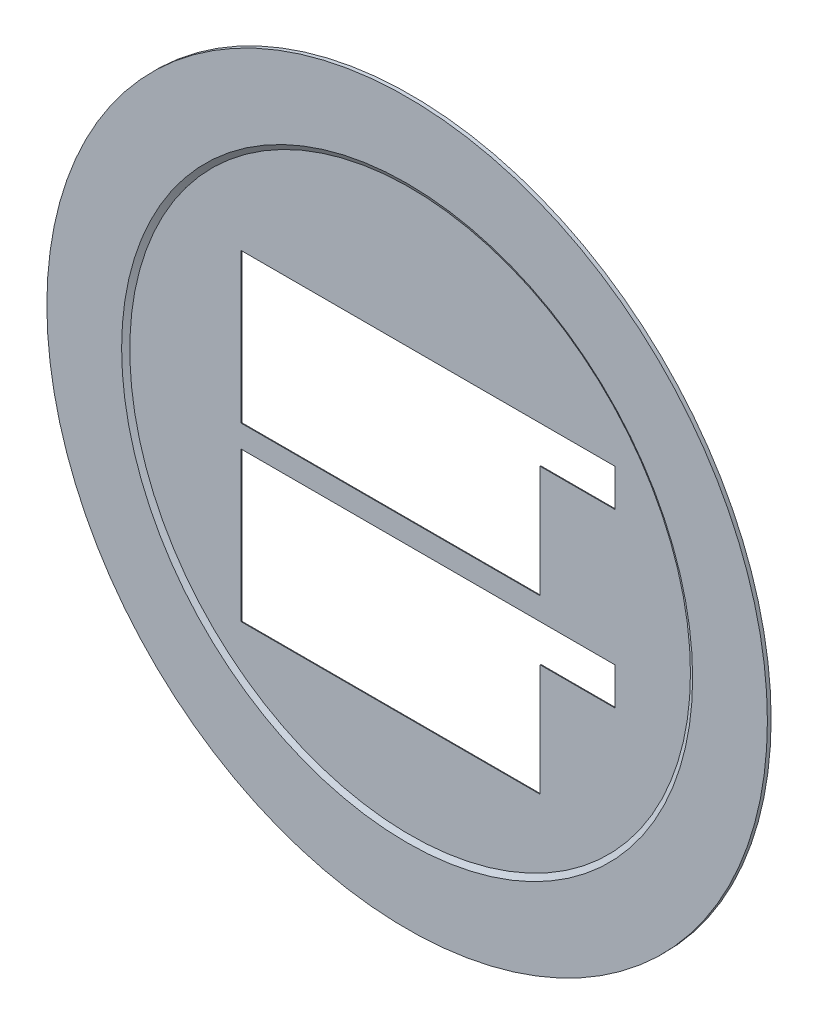
ISO-10303-21;
HEADER;
FILE_DESCRIPTION(('STEP AP214'),'2;1');
FILE_NAME('part.step','',(''),(''),'','','');
FILE_SCHEMA(('AUTOMOTIVE_DESIGN { 1 0 10303 214 1 1 1 1 }'));
ENDSEC;
DATA;
#1=APPLICATION_CONTEXT('core data for automotive mechanical design processes');
#2=APPLICATION_PROTOCOL_DEFINITION('international standard','automotive_design',2000,#1);
#3=PRODUCT_CONTEXT('',#1,'mechanical');
#4=PRODUCT('Part','Part','',(#3));
#5=PRODUCT_RELATED_PRODUCT_CATEGORY('part','',(#4));
#6=PRODUCT_DEFINITION_FORMATION('','',#4);
#7=PRODUCT_DEFINITION_CONTEXT('part definition',#1,'design');
#8=PRODUCT_DEFINITION('design','',#6,#7);
#9=PRODUCT_DEFINITION_SHAPE('','',#8);
#10=(LENGTH_UNIT() NAMED_UNIT(*) SI_UNIT(.MILLI.,.METRE.));
#11=(NAMED_UNIT(*) PLANE_ANGLE_UNIT() SI_UNIT($,.RADIAN.));
#12=(NAMED_UNIT(*) SI_UNIT($,.STERADIAN.) SOLID_ANGLE_UNIT());
#13=UNCERTAINTY_MEASURE_WITH_UNIT(LENGTH_MEASURE(1.E-05),#10,'distance_accuracy_value','');
#14=(GEOMETRIC_REPRESENTATION_CONTEXT(3) GLOBAL_UNCERTAINTY_ASSIGNED_CONTEXT((#13)) GLOBAL_UNIT_ASSIGNED_CONTEXT((#10,
#11,#12)) REPRESENTATION_CONTEXT('',''));
#15=CARTESIAN_POINT('',(0.,0.,0.));
#16=DIRECTION('',(0.,0.,1.));
#17=DIRECTION('',(1.,0.,0.));
#18=AXIS2_PLACEMENT_3D('',#15,#16,#17);
#19=CARTESIAN_POINT('',(0.,0.,0.));
#20=DIRECTION('',(0.,0.,1.));
#21=DIRECTION('',(1.,0.,0.));
#22=AXIS2_PLACEMENT_3D('',#19,#20,#21);
#23=PLANE('',#22);
#24=DIRECTION('',(0.,-1.,0.));
#25=VECTOR('',#24,1.);
#26=CARTESIAN_POINT('',(17.3944245514174,0.,0.));
#27=LINE('',#26,#25);
#28=CARTESIAN_POINT('',(17.3944245514174,-9.08095271213025,0.));
#29=VERTEX_POINT('',#28);
#30=CARTESIAN_POINT('',(17.3944245514174,-24.0809527121303,0.));
#31=VERTEX_POINT('',#30);
#32=EDGE_CURVE('E218',#29,#31,#27,.T.);
#33=ORIENTED_EDGE('',*,*,#32,.F.);
#34=DIRECTION('',(1.,0.,0.));
#35=VECTOR('',#34,1.);
#36=CARTESIAN_POINT('',(0.,-9.08095271213025,0.));
#37=LINE('',#36,#35);
#38=CARTESIAN_POINT('',(27.3944245514174,-9.08095271213025,0.));
#39=VERTEX_POINT('',#38);
#40=EDGE_CURVE('E219',#29,#39,#37,.T.);
#41=ORIENTED_EDGE('',*,*,#40,.T.);
#42=DIRECTION('',(0.,-1.,0.));
#43=VECTOR('',#42,1.);
#44=CARTESIAN_POINT('',(27.3944245514174,0.,0.));
#45=LINE('',#44,#43);
#46=CARTESIAN_POINT('',(27.3944245514174,-4.08095271213025,0.));
#47=VERTEX_POINT('',#46);
#48=EDGE_CURVE('E222',#47,#39,#45,.T.);
#49=ORIENTED_EDGE('',*,*,#48,.F.);
#50=DIRECTION('',(1.,0.,0.));
#51=VECTOR('',#50,1.);
#52=CARTESIAN_POINT('',(0.,-4.08095271213025,0.));
#53=LINE('',#52,#51);
#54=CARTESIAN_POINT('',(-22.6055754485826,-4.08095271213025,0.));
#55=VERTEX_POINT('',#54);
#56=EDGE_CURVE('E228',#55,#47,#53,.T.);
#57=ORIENTED_EDGE('',*,*,#56,.F.);
#58=DIRECTION('',(0.,-1.,0.));
#59=VECTOR('',#58,1.);
#60=CARTESIAN_POINT('',(-22.6055754485826,0.,0.));
#61=LINE('',#60,#59);
#62=CARTESIAN_POINT('',(-22.6055754485826,-24.0809527121303,0.));
#63=VERTEX_POINT('',#62);
#64=EDGE_CURVE('E231',#55,#63,#61,.T.);
#65=ORIENTED_EDGE('',*,*,#64,.T.);
#66=DIRECTION('',(1.,0.,0.));
#67=VECTOR('',#66,1.);
#68=CARTESIAN_POINT('',(0.,-24.0809527121303,0.));
#69=LINE('',#68,#67);
#70=EDGE_CURVE('E234',#63,#31,#69,.T.);
#71=ORIENTED_EDGE('',*,*,#70,.T.);
#72=EDGE_LOOP('',(#33,#41,#49,#57,#65,#71));
#73=FACE_BOUND('',#72,.T.);
#74=CARTESIAN_POINT('',(0.,0.,0.));
#75=DIRECTION('',(0.,0.,1.));
#76=DIRECTION('',(1.,0.,0.));
#77=AXIS2_PLACEMENT_3D('',#74,#75,#76);
#78=CIRCLE('',#77,48.1928203230275);
#79=CARTESIAN_POINT('',(48.1928203230275,0.,0.));
#80=VERTEX_POINT('',#79);
#81=EDGE_CURVE('E204',#80,#80,#78,.T.);
#82=ORIENTED_EDGE('',*,*,#81,.F.);
#83=EDGE_LOOP('',(#82));
#84=FACE_BOUND('',#83,.T.);
#85=DIRECTION('',(0.,-1.,0.));
#86=VECTOR('',#85,1.);
#87=CARTESIAN_POINT('',(17.3944245514174,0.,0.));
#88=LINE('',#87,#86);
#89=CARTESIAN_POINT('',(17.3944245514174,13.9190472878697,0.));
#90=VERTEX_POINT('',#89);
#91=CARTESIAN_POINT('',(17.3944245514174,-1.08095271213025,0.));
#92=VERTEX_POINT('',#91);
#93=EDGE_CURVE('E145',#90,#92,#88,.T.);
#94=ORIENTED_EDGE('',*,*,#93,.F.);
#95=DIRECTION('',(1.,0.,0.));
#96=VECTOR('',#95,1.);
#97=CARTESIAN_POINT('',(0.,13.9190472878697,0.));
#98=LINE('',#97,#96);
#99=CARTESIAN_POINT('',(27.3944245514174,13.9190472878697,0.));
#100=VERTEX_POINT('',#99);
#101=EDGE_CURVE('E152',#90,#100,#98,.T.);
#102=ORIENTED_EDGE('',*,*,#101,.T.);
#103=DIRECTION('',(0.,-1.,0.));
#104=VECTOR('',#103,1.);
#105=CARTESIAN_POINT('',(27.3944245514174,0.,0.));
#106=LINE('',#105,#104);
#107=CARTESIAN_POINT('',(27.3944245514174,18.9190472878698,0.));
#108=VERTEX_POINT('',#107);
#109=EDGE_CURVE('E158',#108,#100,#106,.T.);
#110=ORIENTED_EDGE('',*,*,#109,.F.);
#111=DIRECTION('',(1.,0.,0.));
#112=VECTOR('',#111,1.);
#113=CARTESIAN_POINT('',(0.,18.9190472878698,0.));
#114=LINE('',#113,#112);
#115=CARTESIAN_POINT('',(-22.6055754485826,18.9190472878698,0.));
#116=VERTEX_POINT('',#115);
#117=EDGE_CURVE('E180',#116,#108,#114,.T.);
#118=ORIENTED_EDGE('',*,*,#117,.F.);
#119=DIRECTION('',(0.,-1.,0.));
#120=VECTOR('',#119,1.);
#121=CARTESIAN_POINT('',(-22.6055754485826,0.,0.));
#122=LINE('',#121,#120);
#123=CARTESIAN_POINT('',(-22.6055754485826,-1.08095271213025,0.));
#124=VERTEX_POINT('',#123);
#125=EDGE_CURVE('E179',#116,#124,#122,.T.);
#126=ORIENTED_EDGE('',*,*,#125,.T.);
#127=DIRECTION('',(1.,0.,0.));
#128=VECTOR('',#127,1.);
#129=CARTESIAN_POINT('',(0.,-1.08095271213025,0.));
#130=LINE('',#129,#128);
#131=EDGE_CURVE('E153',#124,#92,#130,.T.);
#132=ORIENTED_EDGE('',*,*,#131,.T.);
#133=EDGE_LOOP('',(#94,#102,#110,#118,#126,#132));
#134=FACE_BOUND('',#133,.T.);
#135=ADVANCED_FACE('F47',(#73,#84,#134),#23,.F.);
#136=CARTESIAN_POINT('',(0.,0.,0.1));
#137=DIRECTION('',(0.,0.,1.));
#138=DIRECTION('',(1.,0.,0.));
#139=AXIS2_PLACEMENT_3D('',#136,#137,#138);
#140=CYLINDRICAL_SURFACE('',#139,48.1928203230275);
#141=CARTESIAN_POINT('',(0.,0.,0.5));
#142=DIRECTION('',(0.,0.,1.));
#143=DIRECTION('',(1.,0.,0.));
#144=AXIS2_PLACEMENT_3D('',#141,#142,#143);
#145=CIRCLE('',#144,48.1928203230275);
#146=CARTESIAN_POINT('',(48.1928203230275,0.,0.5));
#147=VERTEX_POINT('',#146);
#148=EDGE_CURVE('E11',#147,#147,#145,.T.);
#149=ORIENTED_EDGE('',*,*,#148,.F.);
#150=EDGE_LOOP('',(#149));
#151=FACE_BOUND('',#150,.T.);
#152=ORIENTED_EDGE('',*,*,#81,.T.);
#153=EDGE_LOOP('',(#152));
#154=FACE_BOUND('',#153,.T.);
#155=ADVANCED_FACE('F51',(#151,#154),#140,.T.);
#156=CARTESIAN_POINT('',(0.,48.1928203230275,0.499999999999999));
#157=DIRECTION('',(0.,0.,-1.));
#158=DIRECTION('',(-1.,0.,0.));
#159=AXIS2_PLACEMENT_3D('',#156,#157,#158);
#160=PLANE('',#159);
#161=CARTESIAN_POINT('',(0.,0.,0.499999999999999));
#162=DIRECTION('',(0.,0.,1.));
#163=DIRECTION('',(1.,0.,0.));
#164=AXIS2_PLACEMENT_3D('',#161,#162,#163);
#165=CIRCLE('',#164,38.1928203230275);
#166=CARTESIAN_POINT('',(38.1928203230275,0.,0.499999999999999));
#167=VERTEX_POINT('',#166);
#168=EDGE_CURVE('E59',#167,#167,#165,.T.);
#169=ORIENTED_EDGE('',*,*,#168,.F.);
#170=EDGE_LOOP('',(#169));
#171=FACE_BOUND('',#170,.T.);
#172=ORIENTED_EDGE('',*,*,#148,.T.);
#173=EDGE_LOOP('',(#172));
#174=FACE_BOUND('',#173,.T.);
#175=ADVANCED_FACE('F286',(#171,#174),#160,.F.);
#176=CARTESIAN_POINT('',(0.,0.,0.499999999999999));
#177=DIRECTION('',(0.,0.,1.));
#178=DIRECTION('',(1.,0.,0.));
#179=AXIS2_PLACEMENT_3D('',#176,#177,#178);
#180=CONICAL_SURFACE('',#179,38.1928203230275,1.0471975511966);
#181=CARTESIAN_POINT('',(0.,0.,0.100000000000005));
#182=DIRECTION('',(0.,0.,1.));
#183=DIRECTION('',(1.,0.,0.));
#184=AXIS2_PLACEMENT_3D('',#181,#182,#183);
#185=CIRCLE('',#184,37.5);
#186=CARTESIAN_POINT('',(37.5,0.,0.100000000000005));
#187=VERTEX_POINT('',#186);
#188=EDGE_CURVE('E277',#187,#187,#185,.T.);
#189=ORIENTED_EDGE('',*,*,#188,.F.);
#190=EDGE_LOOP('',(#189));
#191=FACE_BOUND('',#190,.T.);
#192=ORIENTED_EDGE('',*,*,#168,.T.);
#193=EDGE_LOOP('',(#192));
#194=FACE_BOUND('',#193,.T.);
#195=ADVANCED_FACE('F288',(#191,#194),#180,.F.);
#196=CARTESIAN_POINT('',(0.,37.5,0.100000000000002));
#197=DIRECTION('',(0.,0.,-1.));
#198=DIRECTION('',(-1.,0.,0.));
#199=AXIS2_PLACEMENT_3D('',#196,#197,#198);
#200=PLANE('',#199);
#201=DIRECTION('',(1.,0.,0.));
#202=VECTOR('',#201,1.);
#203=CARTESIAN_POINT('',(0.,13.9190472878697,0.100000000000002));
#204=LINE('',#203,#202);
#205=CARTESIAN_POINT('',(17.3944245514174,13.9190472878697,0.100000000000002));
#206=VERTEX_POINT('',#205);
#207=CARTESIAN_POINT('',(27.3944245514174,13.9190472878697,0.100000000000002));
#208=VERTEX_POINT('',#207);
#209=EDGE_CURVE('E190',#206,#208,#204,.T.);
#210=ORIENTED_EDGE('',*,*,#209,.F.);
#211=DIRECTION('',(0.,-1.,0.));
#212=VECTOR('',#211,1.);
#213=CARTESIAN_POINT('',(17.3944245514174,0.,0.100000000000002));
#214=LINE('',#213,#212);
#215=CARTESIAN_POINT('',(17.3944245514174,-1.08095271213025,0.100000000000002));
#216=VERTEX_POINT('',#215);
#217=EDGE_CURVE('E144',#206,#216,#214,.T.);
#218=ORIENTED_EDGE('',*,*,#217,.T.);
#219=DIRECTION('',(1.,0.,0.));
#220=VECTOR('',#219,1.);
#221=CARTESIAN_POINT('',(0.,-1.08095271213025,0.100000000000002));
#222=LINE('',#221,#220);
#223=CARTESIAN_POINT('',(-22.6055754485826,-1.08095271213025,0.100000000000002));
#224=VERTEX_POINT('',#223);
#225=EDGE_CURVE('E168',#224,#216,#222,.T.);
#226=ORIENTED_EDGE('',*,*,#225,.F.);
#227=DIRECTION('',(0.,-1.,0.));
#228=VECTOR('',#227,1.);
#229=CARTESIAN_POINT('',(-22.6055754485826,0.,0.100000000000002));
#230=LINE('',#229,#228);
#231=CARTESIAN_POINT('',(-22.6055754485826,18.9190472878698,0.100000000000002));
#232=VERTEX_POINT('',#231);
#233=EDGE_CURVE('E64',#232,#224,#230,.T.);
#234=ORIENTED_EDGE('',*,*,#233,.F.);
#235=DIRECTION('',(1.,0.,0.));
#236=VECTOR('',#235,1.);
#237=CARTESIAN_POINT('',(0.,18.9190472878698,0.100000000000002));
#238=LINE('',#237,#236);
#239=CARTESIAN_POINT('',(27.3944245514174,18.9190472878698,0.100000000000002));
#240=VERTEX_POINT('',#239);
#241=EDGE_CURVE('E193',#232,#240,#238,.T.);
#242=ORIENTED_EDGE('',*,*,#241,.T.);
#243=DIRECTION('',(0.,-1.,0.));
#244=VECTOR('',#243,1.);
#245=CARTESIAN_POINT('',(27.3944245514174,0.,0.100000000000002));
#246=LINE('',#245,#244);
#247=EDGE_CURVE('E192',#240,#208,#246,.T.);
#248=ORIENTED_EDGE('',*,*,#247,.T.);
#249=EDGE_LOOP('',(#210,#218,#226,#234,#242,#248));
#250=FACE_BOUND('',#249,.T.);
#251=DIRECTION('',(1.,0.,0.));
#252=VECTOR('',#251,1.);
#253=CARTESIAN_POINT('',(0.,-9.08095271213025,0.100000000000002));
#254=LINE('',#253,#252);
#255=CARTESIAN_POINT('',(17.3944245514174,-9.08095271213025,0.100000000000002));
#256=VERTEX_POINT('',#255);
#257=CARTESIAN_POINT('',(27.3944245514174,-9.08095271213025,0.100000000000002));
#258=VERTEX_POINT('',#257);
#259=EDGE_CURVE('E242',#256,#258,#254,.T.);
#260=ORIENTED_EDGE('',*,*,#259,.F.);
#261=DIRECTION('',(0.,-1.,0.));
#262=VECTOR('',#261,1.);
#263=CARTESIAN_POINT('',(17.3944245514174,0.,0.100000000000002));
#264=LINE('',#263,#262);
#265=CARTESIAN_POINT('',(17.3944245514174,-24.0809527121303,0.100000000000002));
#266=VERTEX_POINT('',#265);
#267=EDGE_CURVE('E238',#256,#266,#264,.T.);
#268=ORIENTED_EDGE('',*,*,#267,.T.);
#269=DIRECTION('',(1.,0.,0.));
#270=VECTOR('',#269,1.);
#271=CARTESIAN_POINT('',(0.,-24.0809527121303,0.100000000000002));
#272=LINE('',#271,#270);
#273=CARTESIAN_POINT('',(-22.6055754485826,-24.0809527121303,0.100000000000002));
#274=VERTEX_POINT('',#273);
#275=EDGE_CURVE('E217',#274,#266,#272,.T.);
#276=ORIENTED_EDGE('',*,*,#275,.F.);
#277=DIRECTION('',(0.,-1.,0.));
#278=VECTOR('',#277,1.);
#279=CARTESIAN_POINT('',(-22.6055754485826,0.,0.100000000000002));
#280=LINE('',#279,#278);
#281=CARTESIAN_POINT('',(-22.6055754485826,-4.08095271213025,0.100000000000002));
#282=VERTEX_POINT('',#281);
#283=EDGE_CURVE('E71',#282,#274,#280,.T.);
#284=ORIENTED_EDGE('',*,*,#283,.F.);
#285=DIRECTION('',(1.,0.,0.));
#286=VECTOR('',#285,1.);
#287=CARTESIAN_POINT('',(0.,-4.08095271213025,0.100000000000002));
#288=LINE('',#287,#286);
#289=CARTESIAN_POINT('',(27.3944245514174,-4.08095271213025,0.100000000000002));
#290=VERTEX_POINT('',#289);
#291=EDGE_CURVE('E255',#282,#290,#288,.T.);
#292=ORIENTED_EDGE('',*,*,#291,.T.);
#293=DIRECTION('',(0.,-1.,0.));
#294=VECTOR('',#293,1.);
#295=CARTESIAN_POINT('',(27.3944245514174,0.,0.100000000000002));
#296=LINE('',#295,#294);
#297=EDGE_CURVE('E246',#290,#258,#296,.T.);
#298=ORIENTED_EDGE('',*,*,#297,.T.);
#299=EDGE_LOOP('',(#260,#268,#276,#284,#292,#298));
#300=FACE_BOUND('',#299,.T.);
#301=ORIENTED_EDGE('',*,*,#188,.T.);
#302=EDGE_LOOP('',(#301));
#303=FACE_BOUND('',#302,.T.);
#304=ADVANCED_FACE('F308',(#250,#300,#303),#200,.F.);
#305=CARTESIAN_POINT('',(17.3944245514174,0.,0.));
#306=DIRECTION('',(-1.,0.,0.));
#307=DIRECTION('',(0.,0.,1.));
#308=AXIS2_PLACEMENT_3D('',#305,#306,#307);
#309=PLANE('',#308);
#310=ORIENTED_EDGE('',*,*,#267,.F.);
#311=DIRECTION('',(0.,0.,1.));
#312=VECTOR('',#311,1.);
#313=CARTESIAN_POINT('',(17.3944245514174,-9.08095271213025,0.));
#314=LINE('',#313,#312);
#315=EDGE_CURVE('E236',#29,#256,#314,.T.);
#316=ORIENTED_EDGE('',*,*,#315,.F.);
#317=ORIENTED_EDGE('',*,*,#32,.T.);
#318=DIRECTION('',(0.,0.,1.));
#319=VECTOR('',#318,1.);
#320=CARTESIAN_POINT('',(17.3944245514174,-24.0809527121303,0.));
#321=LINE('',#320,#319);
#322=EDGE_CURVE('E187',#31,#266,#321,.T.);
#323=ORIENTED_EDGE('',*,*,#322,.T.);
#324=EDGE_LOOP('',(#310,#316,#317,#323));
#325=FACE_BOUND('',#324,.T.);
#326=ADVANCED_FACE('F305',(#325),#309,.T.);
#327=CARTESIAN_POINT('',(0.,-24.0809527121303,0.));
#328=DIRECTION('',(0.,-1.,0.));
#329=DIRECTION('',(0.,0.,-1.));
#330=AXIS2_PLACEMENT_3D('',#327,#328,#329);
#331=PLANE('',#330);
#332=ORIENTED_EDGE('',*,*,#275,.T.);
#333=ORIENTED_EDGE('',*,*,#322,.F.);
#334=ORIENTED_EDGE('',*,*,#70,.F.);
#335=DIRECTION('',(0.,0.,1.));
#336=VECTOR('',#335,1.);
#337=CARTESIAN_POINT('',(-22.6055754485826,-24.0809527121303,0.));
#338=LINE('',#337,#336);
#339=EDGE_CURVE('E265',#63,#274,#338,.T.);
#340=ORIENTED_EDGE('',*,*,#339,.T.);
#341=EDGE_LOOP('',(#332,#333,#334,#340));
#342=FACE_BOUND('',#341,.T.);
#343=ADVANCED_FACE('F323',(#342),#331,.F.);
#344=CARTESIAN_POINT('',(-22.6055754485826,0.,0.));
#345=DIRECTION('',(-1.,0.,0.));
#346=DIRECTION('',(0.,0.,1.));
#347=AXIS2_PLACEMENT_3D('',#344,#345,#346);
#348=PLANE('',#347);
#349=ORIENTED_EDGE('',*,*,#283,.T.);
#350=ORIENTED_EDGE('',*,*,#339,.F.);
#351=ORIENTED_EDGE('',*,*,#64,.F.);
#352=DIRECTION('',(0.,0.,1.));
#353=VECTOR('',#352,1.);
#354=CARTESIAN_POINT('',(-22.6055754485826,-4.08095271213025,0.));
#355=LINE('',#354,#353);
#356=EDGE_CURVE('E262',#55,#282,#355,.T.);
#357=ORIENTED_EDGE('',*,*,#356,.T.);
#358=EDGE_LOOP('',(#349,#350,#351,#357));
#359=FACE_BOUND('',#358,.T.);
#360=ADVANCED_FACE('F328',(#359),#348,.F.);
#361=CARTESIAN_POINT('',(0.,-4.08095271213025,0.));
#362=DIRECTION('',(0.,-1.,0.));
#363=DIRECTION('',(0.,0.,-1.));
#364=AXIS2_PLACEMENT_3D('',#361,#362,#363);
#365=PLANE('',#364);
#366=ORIENTED_EDGE('',*,*,#291,.F.);
#367=ORIENTED_EDGE('',*,*,#356,.F.);
#368=ORIENTED_EDGE('',*,*,#56,.T.);
#369=DIRECTION('',(0.,0.,1.));
#370=VECTOR('',#369,1.);
#371=CARTESIAN_POINT('',(27.3944245514174,-4.08095271213025,0.));
#372=LINE('',#371,#370);
#373=EDGE_CURVE('E268',#47,#290,#372,.T.);
#374=ORIENTED_EDGE('',*,*,#373,.T.);
#375=EDGE_LOOP('',(#366,#367,#368,#374));
#376=FACE_BOUND('',#375,.T.);
#377=ADVANCED_FACE('F340',(#376),#365,.T.);
#378=CARTESIAN_POINT('',(27.3944245514174,0.,0.));
#379=DIRECTION('',(-1.,0.,0.));
#380=DIRECTION('',(0.,0.,1.));
#381=AXIS2_PLACEMENT_3D('',#378,#379,#380);
#382=PLANE('',#381);
#383=ORIENTED_EDGE('',*,*,#297,.F.);
#384=ORIENTED_EDGE('',*,*,#373,.F.);
#385=ORIENTED_EDGE('',*,*,#48,.T.);
#386=DIRECTION('',(0.,0.,1.));
#387=VECTOR('',#386,1.);
#388=CARTESIAN_POINT('',(27.3944245514174,-9.08095271213025,0.));
#389=LINE('',#388,#387);
#390=EDGE_CURVE('E271',#39,#258,#389,.T.);
#391=ORIENTED_EDGE('',*,*,#390,.T.);
#392=EDGE_LOOP('',(#383,#384,#385,#391));
#393=FACE_BOUND('',#392,.T.);
#394=ADVANCED_FACE('F341',(#393),#382,.T.);
#395=CARTESIAN_POINT('',(0.,-9.08095271213025,0.));
#396=DIRECTION('',(0.,-1.,0.));
#397=DIRECTION('',(0.,0.,-1.));
#398=AXIS2_PLACEMENT_3D('',#395,#396,#397);
#399=PLANE('',#398);
#400=ORIENTED_EDGE('',*,*,#259,.T.);
#401=ORIENTED_EDGE('',*,*,#390,.F.);
#402=ORIENTED_EDGE('',*,*,#40,.F.);
#403=ORIENTED_EDGE('',*,*,#315,.T.);
#404=EDGE_LOOP('',(#400,#401,#402,#403));
#405=FACE_BOUND('',#404,.T.);
#406=ADVANCED_FACE('F349',(#405),#399,.F.);
#407=CARTESIAN_POINT('',(17.3944245514174,0.,0.));
#408=DIRECTION('',(-1.,0.,0.));
#409=DIRECTION('',(0.,-1.,0.));
#410=AXIS2_PLACEMENT_3D('',#407,#408,#409);
#411=PLANE('',#410);
#412=ORIENTED_EDGE('',*,*,#217,.F.);
#413=DIRECTION('',(0.,0.,1.));
#414=VECTOR('',#413,1.);
#415=CARTESIAN_POINT('',(17.3944245514174,13.9190472878697,0.));
#416=LINE('',#415,#414);
#417=EDGE_CURVE('E138',#90,#206,#416,.T.);
#418=ORIENTED_EDGE('',*,*,#417,.F.);
#419=ORIENTED_EDGE('',*,*,#93,.T.);
#420=DIRECTION('',(0.,0.,1.));
#421=VECTOR('',#420,1.);
#422=CARTESIAN_POINT('',(17.3944245514174,-1.08095271213025,0.));
#423=LINE('',#422,#421);
#424=EDGE_CURVE('E202',#92,#216,#423,.T.);
#425=ORIENTED_EDGE('',*,*,#424,.T.);
#426=EDGE_LOOP('',(#412,#418,#419,#425));
#427=FACE_BOUND('',#426,.T.);
#428=ADVANCED_FACE('F139',(#427),#411,.T.);
#429=CARTESIAN_POINT('',(0.,-1.08095271213025,0.));
#430=DIRECTION('',(0.,-1.,0.));
#431=DIRECTION('',(1.,0.,0.));
#432=AXIS2_PLACEMENT_3D('',#429,#430,#431);
#433=PLANE('',#432);
#434=ORIENTED_EDGE('',*,*,#225,.T.);
#435=ORIENTED_EDGE('',*,*,#424,.F.);
#436=ORIENTED_EDGE('',*,*,#131,.F.);
#437=DIRECTION('',(0.,0.,1.));
#438=VECTOR('',#437,1.);
#439=CARTESIAN_POINT('',(-22.6055754485826,-1.08095271213025,0.));
#440=LINE('',#439,#438);
#441=EDGE_CURVE('E203',#124,#224,#440,.T.);
#442=ORIENTED_EDGE('',*,*,#441,.T.);
#443=EDGE_LOOP('',(#434,#435,#436,#442));
#444=FACE_BOUND('',#443,.T.);
#445=ADVANCED_FACE('F365',(#444),#433,.F.);
#446=CARTESIAN_POINT('',(-22.6055754485826,0.,0.));
#447=DIRECTION('',(-1.,0.,0.));
#448=DIRECTION('',(0.,0.,1.));
#449=AXIS2_PLACEMENT_3D('',#446,#447,#448);
#450=PLANE('',#449);
#451=ORIENTED_EDGE('',*,*,#233,.T.);
#452=ORIENTED_EDGE('',*,*,#441,.F.);
#453=ORIENTED_EDGE('',*,*,#125,.F.);
#454=DIRECTION('',(0.,0.,1.));
#455=VECTOR('',#454,1.);
#456=CARTESIAN_POINT('',(-22.6055754485826,18.9190472878698,0.));
#457=LINE('',#456,#455);
#458=EDGE_CURVE('E206',#116,#232,#457,.T.);
#459=ORIENTED_EDGE('',*,*,#458,.T.);
#460=EDGE_LOOP('',(#451,#452,#453,#459));
#461=FACE_BOUND('',#460,.T.);
#462=ADVANCED_FACE('F367',(#461),#450,.F.);
#463=CARTESIAN_POINT('',(0.,18.9190472878698,0.));
#464=DIRECTION('',(0.,-1.,0.));
#465=DIRECTION('',(0.,0.,-1.));
#466=AXIS2_PLACEMENT_3D('',#463,#464,#465);
#467=PLANE('',#466);
#468=ORIENTED_EDGE('',*,*,#241,.F.);
#469=ORIENTED_EDGE('',*,*,#458,.F.);
#470=ORIENTED_EDGE('',*,*,#117,.T.);
#471=DIRECTION('',(0.,0.,1.));
#472=VECTOR('',#471,1.);
#473=CARTESIAN_POINT('',(27.3944245514174,18.9190472878698,0.));
#474=LINE('',#473,#472);
#475=EDGE_CURVE('E213',#108,#240,#474,.T.);
#476=ORIENTED_EDGE('',*,*,#475,.T.);
#477=EDGE_LOOP('',(#468,#469,#470,#476));
#478=FACE_BOUND('',#477,.T.);
#479=ADVANCED_FACE('F373',(#478),#467,.T.);
#480=CARTESIAN_POINT('',(27.3944245514174,0.,0.));
#481=DIRECTION('',(-1.,0.,0.));
#482=DIRECTION('',(0.,-1.,0.));
#483=AXIS2_PLACEMENT_3D('',#480,#481,#482);
#484=PLANE('',#483);
#485=ORIENTED_EDGE('',*,*,#247,.F.);
#486=ORIENTED_EDGE('',*,*,#475,.F.);
#487=ORIENTED_EDGE('',*,*,#109,.T.);
#488=DIRECTION('',(0.,0.,1.));
#489=VECTOR('',#488,1.);
#490=CARTESIAN_POINT('',(27.3944245514174,13.9190472878697,0.));
#491=LINE('',#490,#489);
#492=EDGE_CURVE('E148',#100,#208,#491,.T.);
#493=ORIENTED_EDGE('',*,*,#492,.T.);
#494=EDGE_LOOP('',(#485,#486,#487,#493));
#495=FACE_BOUND('',#494,.T.);
#496=ADVANCED_FACE('F382',(#495),#484,.T.);
#497=CARTESIAN_POINT('',(0.,13.9190472878697,0.));
#498=DIRECTION('',(0.,-1.,0.));
#499=DIRECTION('',(0.,0.,-1.));
#500=AXIS2_PLACEMENT_3D('',#497,#498,#499);
#501=PLANE('',#500);
#502=ORIENTED_EDGE('',*,*,#209,.T.);
#503=ORIENTED_EDGE('',*,*,#492,.F.);
#504=ORIENTED_EDGE('',*,*,#101,.F.);
#505=ORIENTED_EDGE('',*,*,#417,.T.);
#506=EDGE_LOOP('',(#502,#503,#504,#505));
#507=FACE_BOUND('',#506,.T.);
#508=ADVANCED_FACE('F154',(#507),#501,.F.);
#509=CLOSED_SHELL('',(#135,#155,#175,#195,#304,#326,#343,#360,#377,#394,#406,#428,#445,#462,
#479,#496,#508));
#510=MANIFOLD_SOLID_BREP('B2',#509);
#511=ADVANCED_BREP_SHAPE_REPRESENTATION('',(#18,#510),#14);
#512=SHAPE_DEFINITION_REPRESENTATION(#9,#511);
ENDSEC;
END-ISO-10303-21;
